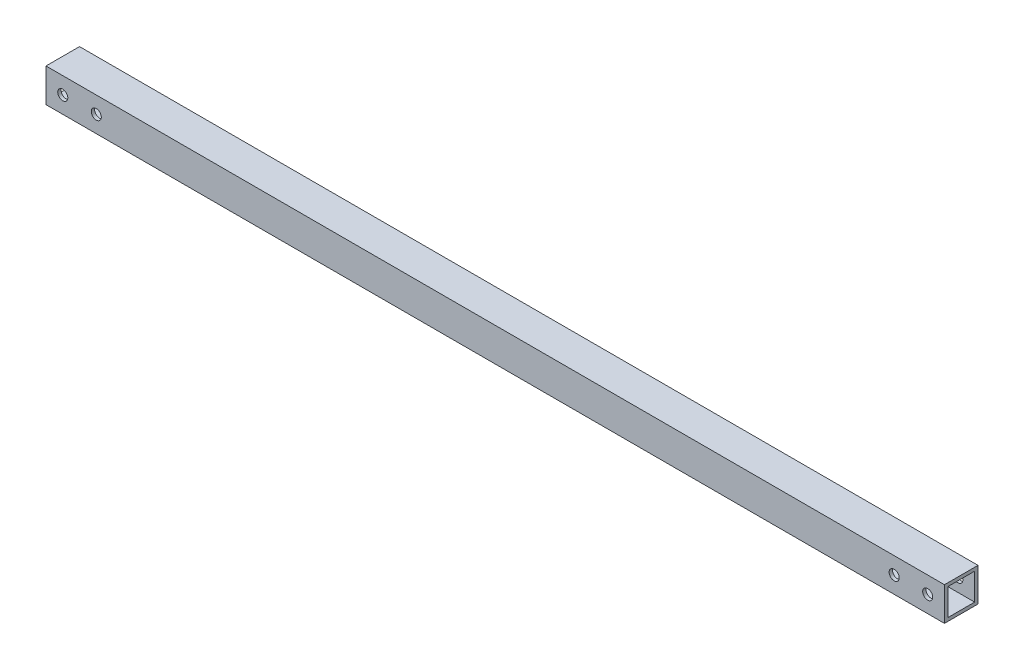
ISO-10303-21;
HEADER;
FILE_DESCRIPTION(('STEP AP214'),'2;1');
FILE_NAME('part.step','',(''),(''),'','','');
FILE_SCHEMA(('AUTOMOTIVE_DESIGN { 1 0 10303 214 1 1 1 1 }'));
ENDSEC;
DATA;
#1=APPLICATION_CONTEXT('core data for automotive mechanical design processes');
#2=APPLICATION_PROTOCOL_DEFINITION('international standard','automotive_design',2000,#1);
#3=PRODUCT_CONTEXT('',#1,'mechanical');
#4=PRODUCT('Part','Part','',(#3));
#5=PRODUCT_RELATED_PRODUCT_CATEGORY('part','',(#4));
#6=PRODUCT_DEFINITION_FORMATION('','',#4);
#7=PRODUCT_DEFINITION_CONTEXT('part definition',#1,'design');
#8=PRODUCT_DEFINITION('design','',#6,#7);
#9=PRODUCT_DEFINITION_SHAPE('','',#8);
#10=(LENGTH_UNIT() NAMED_UNIT(*) SI_UNIT(.MILLI.,.METRE.));
#11=(NAMED_UNIT(*) PLANE_ANGLE_UNIT() SI_UNIT($,.RADIAN.));
#12=(NAMED_UNIT(*) SI_UNIT($,.STERADIAN.) SOLID_ANGLE_UNIT());
#13=UNCERTAINTY_MEASURE_WITH_UNIT(LENGTH_MEASURE(1.E-05),#10,'distance_accuracy_value','');
#14=(GEOMETRIC_REPRESENTATION_CONTEXT(3) GLOBAL_UNCERTAINTY_ASSIGNED_CONTEXT((#13)) GLOBAL_UNIT_ASSIGNED_CONTEXT((#10,
#11,#12)) REPRESENTATION_CONTEXT('',''));
#15=CARTESIAN_POINT('',(0.,0.,0.));
#16=DIRECTION('',(0.,0.,1.));
#17=DIRECTION('',(1.,0.,0.));
#18=AXIS2_PLACEMENT_3D('',#15,#16,#17);
#19=CARTESIAN_POINT('',(268.,0.,0.));
#20=DIRECTION('',(1.,0.,0.));
#21=DIRECTION('',(0.,0.,-1.));
#22=AXIS2_PLACEMENT_3D('',#19,#20,#21);
#23=PLANE('',#22);
#24=DIRECTION('',(0.,-1.,0.));
#25=VECTOR('',#24,1.);
#26=CARTESIAN_POINT('',(268.,10.,10.));
#27=LINE('',#26,#25);
#28=CARTESIAN_POINT('',(268.,10.,10.));
#29=VERTEX_POINT('',#28);
#30=CARTESIAN_POINT('',(268.,-10.,10.));
#31=VERTEX_POINT('',#30);
#32=EDGE_CURVE('E140',#29,#31,#27,.T.);
#33=ORIENTED_EDGE('',*,*,#32,.T.);
#34=DIRECTION('',(0.,0.,-1.));
#35=VECTOR('',#34,1.);
#36=CARTESIAN_POINT('',(268.,-10.,10.));
#37=LINE('',#36,#35);
#38=CARTESIAN_POINT('',(268.,-10.,-10.));
#39=VERTEX_POINT('',#38);
#40=EDGE_CURVE('E143',#31,#39,#37,.T.);
#41=ORIENTED_EDGE('',*,*,#40,.T.);
#42=DIRECTION('',(0.,1.,0.));
#43=VECTOR('',#42,1.);
#44=CARTESIAN_POINT('',(268.,10.,-10.));
#45=LINE('',#44,#43);
#46=CARTESIAN_POINT('',(268.,10.,-10.));
#47=VERTEX_POINT('',#46);
#48=EDGE_CURVE('E146',#39,#47,#45,.T.);
#49=ORIENTED_EDGE('',*,*,#48,.T.);
#50=DIRECTION('',(0.,0.,1.));
#51=VECTOR('',#50,1.);
#52=CARTESIAN_POINT('',(268.,10.,10.));
#53=LINE('',#52,#51);
#54=EDGE_CURVE('E148',#47,#29,#53,.T.);
#55=ORIENTED_EDGE('',*,*,#54,.T.);
#56=EDGE_LOOP('',(#33,#41,#49,#55));
#57=FACE_BOUND('',#56,.T.);
#58=DIRECTION('',(0.,1.,0.));
#59=VECTOR('',#58,1.);
#60=CARTESIAN_POINT('',(268.,8.,-8.));
#61=LINE('',#60,#59);
#62=CARTESIAN_POINT('',(268.,-8.,-8.));
#63=VERTEX_POINT('',#62);
#64=CARTESIAN_POINT('',(268.,8.,-8.));
#65=VERTEX_POINT('',#64);
#66=EDGE_CURVE('E110',#63,#65,#61,.T.);
#67=ORIENTED_EDGE('',*,*,#66,.F.);
#68=DIRECTION('',(0.,0.,-1.));
#69=VECTOR('',#68,1.);
#70=CARTESIAN_POINT('',(268.,-8.,-8.));
#71=LINE('',#70,#69);
#72=CARTESIAN_POINT('',(268.,-8.,8.));
#73=VERTEX_POINT('',#72);
#74=EDGE_CURVE('E102',#73,#63,#71,.T.);
#75=ORIENTED_EDGE('',*,*,#74,.F.);
#76=DIRECTION('',(0.,-1.,0.));
#77=VECTOR('',#76,1.);
#78=CARTESIAN_POINT('',(268.,8.,8.));
#79=LINE('',#78,#77);
#80=CARTESIAN_POINT('',(268.,8.,8.));
#81=VERTEX_POINT('',#80);
#82=EDGE_CURVE('E124',#81,#73,#79,.T.);
#83=ORIENTED_EDGE('',*,*,#82,.F.);
#84=DIRECTION('',(0.,0.,1.));
#85=VECTOR('',#84,1.);
#86=CARTESIAN_POINT('',(268.,8.,-8.));
#87=LINE('',#86,#85);
#88=EDGE_CURVE('E122',#65,#81,#87,.T.);
#89=ORIENTED_EDGE('',*,*,#88,.F.);
#90=EDGE_LOOP('',(#67,#75,#83,#89));
#91=FACE_BOUND('',#90,.T.);
#92=ADVANCED_FACE('F35',(#57,#91),#23,.T.);
#93=CARTESIAN_POINT('',(-268.,0.,0.));
#94=DIRECTION('',(1.,0.,0.));
#95=DIRECTION('',(0.,0.,-1.));
#96=AXIS2_PLACEMENT_3D('',#93,#94,#95);
#97=PLANE('',#96);
#98=DIRECTION('',(0.,-1.,0.));
#99=VECTOR('',#98,1.);
#100=CARTESIAN_POINT('',(-268.,10.,10.));
#101=LINE('',#100,#99);
#102=CARTESIAN_POINT('',(-268.,10.,10.));
#103=VERTEX_POINT('',#102);
#104=CARTESIAN_POINT('',(-268.,-10.,10.));
#105=VERTEX_POINT('',#104);
#106=EDGE_CURVE('E118',#103,#105,#101,.T.);
#107=ORIENTED_EDGE('',*,*,#106,.F.);
#108=DIRECTION('',(0.,0.,1.));
#109=VECTOR('',#108,1.);
#110=CARTESIAN_POINT('',(-268.,10.,10.));
#111=LINE('',#110,#109);
#112=CARTESIAN_POINT('',(-268.,10.,-10.));
#113=VERTEX_POINT('',#112);
#114=EDGE_CURVE('E144',#113,#103,#111,.T.);
#115=ORIENTED_EDGE('',*,*,#114,.F.);
#116=DIRECTION('',(0.,1.,0.));
#117=VECTOR('',#116,1.);
#118=CARTESIAN_POINT('',(-268.,10.,-10.));
#119=LINE('',#118,#117);
#120=CARTESIAN_POINT('',(-268.,-10.,-10.));
#121=VERTEX_POINT('',#120);
#122=EDGE_CURVE('E155',#121,#113,#119,.T.);
#123=ORIENTED_EDGE('',*,*,#122,.F.);
#124=DIRECTION('',(0.,0.,-1.));
#125=VECTOR('',#124,1.);
#126=CARTESIAN_POINT('',(-268.,-10.,10.));
#127=LINE('',#126,#125);
#128=EDGE_CURVE('E153',#105,#121,#127,.T.);
#129=ORIENTED_EDGE('',*,*,#128,.F.);
#130=EDGE_LOOP('',(#107,#115,#123,#129));
#131=FACE_BOUND('',#130,.T.);
#132=DIRECTION('',(0.,0.,-1.));
#133=VECTOR('',#132,1.);
#134=CARTESIAN_POINT('',(-268.,-8.,-8.));
#135=LINE('',#134,#133);
#136=CARTESIAN_POINT('',(-268.,-8.,8.));
#137=VERTEX_POINT('',#136);
#138=CARTESIAN_POINT('',(-268.,-8.,-8.));
#139=VERTEX_POINT('',#138);
#140=EDGE_CURVE('E60',#137,#139,#135,.T.);
#141=ORIENTED_EDGE('',*,*,#140,.T.);
#142=DIRECTION('',(0.,1.,0.));
#143=VECTOR('',#142,1.);
#144=CARTESIAN_POINT('',(-268.,8.,-8.));
#145=LINE('',#144,#143);
#146=CARTESIAN_POINT('',(-268.,8.,-8.));
#147=VERTEX_POINT('',#146);
#148=EDGE_CURVE('E117',#139,#147,#145,.T.);
#149=ORIENTED_EDGE('',*,*,#148,.T.);
#150=DIRECTION('',(0.,0.,1.));
#151=VECTOR('',#150,1.);
#152=CARTESIAN_POINT('',(-268.,8.,-8.));
#153=LINE('',#152,#151);
#154=CARTESIAN_POINT('',(-268.,8.,8.));
#155=VERTEX_POINT('',#154);
#156=EDGE_CURVE('E132',#147,#155,#153,.T.);
#157=ORIENTED_EDGE('',*,*,#156,.T.);
#158=DIRECTION('',(0.,-1.,0.));
#159=VECTOR('',#158,1.);
#160=CARTESIAN_POINT('',(-268.,8.,8.));
#161=LINE('',#160,#159);
#162=EDGE_CURVE('E111',#155,#137,#161,.T.);
#163=ORIENTED_EDGE('',*,*,#162,.T.);
#164=EDGE_LOOP('',(#141,#149,#157,#163));
#165=FACE_BOUND('',#164,.T.);
#166=ADVANCED_FACE('F227',(#131,#165),#97,.F.);
#167=CARTESIAN_POINT('',(268.,10.,10.));
#168=DIRECTION('',(0.,0.,-1.));
#169=DIRECTION('',(-1.,0.,0.));
#170=AXIS2_PLACEMENT_3D('',#167,#168,#169);
#171=PLANE('',#170);
#172=CARTESIAN_POINT('',(-258.,0.,10.));
#173=DIRECTION('',(0.,0.,1.));
#174=DIRECTION('',(1.,0.,0.));
#175=AXIS2_PLACEMENT_3D('',#172,#173,#174);
#176=CIRCLE('',#175,2.99999999999999);
#177=CARTESIAN_POINT('',(-255.,0.,10.));
#178=VERTEX_POINT('',#177);
#179=EDGE_CURVE('E299',#178,#178,#176,.T.);
#180=ORIENTED_EDGE('',*,*,#179,.F.);
#181=EDGE_LOOP('',(#180));
#182=FACE_BOUND('',#181,.T.);
#183=CARTESIAN_POINT('',(-238.,0.,10.));
#184=DIRECTION('',(0.,0.,1.));
#185=DIRECTION('',(1.,0.,0.));
#186=AXIS2_PLACEMENT_3D('',#183,#184,#185);
#187=CIRCLE('',#186,2.99999999999999);
#188=CARTESIAN_POINT('',(-235.,0.,10.));
#189=VERTEX_POINT('',#188);
#190=EDGE_CURVE('E183',#189,#189,#187,.T.);
#191=ORIENTED_EDGE('',*,*,#190,.F.);
#192=EDGE_LOOP('',(#191));
#193=FACE_BOUND('',#192,.T.);
#194=CARTESIAN_POINT('',(238.,0.,10.));
#195=DIRECTION('',(0.,0.,1.));
#196=DIRECTION('',(1.,0.,0.));
#197=AXIS2_PLACEMENT_3D('',#194,#195,#196);
#198=CIRCLE('',#197,2.99999999999999);
#199=CARTESIAN_POINT('',(241.,0.,10.));
#200=VERTEX_POINT('',#199);
#201=EDGE_CURVE('E180',#200,#200,#198,.T.);
#202=ORIENTED_EDGE('',*,*,#201,.F.);
#203=EDGE_LOOP('',(#202));
#204=FACE_BOUND('',#203,.T.);
#205=CARTESIAN_POINT('',(258.,0.,10.));
#206=DIRECTION('',(0.,0.,1.));
#207=DIRECTION('',(1.,0.,0.));
#208=AXIS2_PLACEMENT_3D('',#205,#206,#207);
#209=CIRCLE('',#208,2.99999999999999);
#210=CARTESIAN_POINT('',(261.,0.,10.));
#211=VERTEX_POINT('',#210);
#212=EDGE_CURVE('E199',#211,#211,#209,.T.);
#213=ORIENTED_EDGE('',*,*,#212,.F.);
#214=EDGE_LOOP('',(#213));
#215=FACE_BOUND('',#214,.T.);
#216=ORIENTED_EDGE('',*,*,#106,.T.);
#217=DIRECTION('',(-1.,0.,0.));
#218=VECTOR('',#217,1.);
#219=CARTESIAN_POINT('',(268.,-10.,10.));
#220=LINE('',#219,#218);
#221=EDGE_CURVE('E11',#31,#105,#220,.T.);
#222=ORIENTED_EDGE('',*,*,#221,.F.);
#223=ORIENTED_EDGE('',*,*,#32,.F.);
#224=DIRECTION('',(-1.,0.,0.));
#225=VECTOR('',#224,1.);
#226=CARTESIAN_POINT('',(268.,10.,10.));
#227=LINE('',#226,#225);
#228=EDGE_CURVE('E150',#29,#103,#227,.T.);
#229=ORIENTED_EDGE('',*,*,#228,.T.);
#230=EDGE_LOOP('',(#216,#222,#223,#229));
#231=FACE_BOUND('',#230,.T.);
#232=ADVANCED_FACE('F37',(#182,#193,#204,#215,#231),#171,.F.);
#233=CARTESIAN_POINT('',(268.,-10.,10.));
#234=DIRECTION('',(0.,1.,0.));
#235=DIRECTION('',(0.,0.,1.));
#236=AXIS2_PLACEMENT_3D('',#233,#234,#235);
#237=PLANE('',#236);
#238=ORIENTED_EDGE('',*,*,#128,.T.);
#239=DIRECTION('',(-1.,0.,0.));
#240=VECTOR('',#239,1.);
#241=CARTESIAN_POINT('',(268.,-10.,-10.));
#242=LINE('',#241,#240);
#243=EDGE_CURVE('E44',#39,#121,#242,.T.);
#244=ORIENTED_EDGE('',*,*,#243,.F.);
#245=ORIENTED_EDGE('',*,*,#40,.F.);
#246=ORIENTED_EDGE('',*,*,#221,.T.);
#247=EDGE_LOOP('',(#238,#244,#245,#246));
#248=FACE_BOUND('',#247,.T.);
#249=ADVANCED_FACE('F240',(#248),#237,.F.);
#250=CARTESIAN_POINT('',(268.,10.,-10.));
#251=DIRECTION('',(0.,0.,1.));
#252=DIRECTION('',(1.,0.,0.));
#253=AXIS2_PLACEMENT_3D('',#250,#251,#252);
#254=PLANE('',#253);
#255=CARTESIAN_POINT('',(-258.,0.,-10.));
#256=DIRECTION('',(0.,0.,1.));
#257=DIRECTION('',(1.,0.,0.));
#258=AXIS2_PLACEMENT_3D('',#255,#256,#257);
#259=CIRCLE('',#258,2.99999999999999);
#260=CARTESIAN_POINT('',(-255.,0.,-10.));
#261=VERTEX_POINT('',#260);
#262=EDGE_CURVE('E300',#261,#261,#259,.T.);
#263=ORIENTED_EDGE('',*,*,#262,.T.);
#264=EDGE_LOOP('',(#263));
#265=FACE_BOUND('',#264,.T.);
#266=CARTESIAN_POINT('',(-238.,0.,-10.));
#267=DIRECTION('',(0.,0.,1.));
#268=DIRECTION('',(1.,0.,0.));
#269=AXIS2_PLACEMENT_3D('',#266,#267,#268);
#270=CIRCLE('',#269,2.99999999999999);
#271=CARTESIAN_POINT('',(-235.,0.,-10.));
#272=VERTEX_POINT('',#271);
#273=EDGE_CURVE('E176',#272,#272,#270,.T.);
#274=ORIENTED_EDGE('',*,*,#273,.T.);
#275=EDGE_LOOP('',(#274));
#276=FACE_BOUND('',#275,.T.);
#277=CARTESIAN_POINT('',(238.,0.,-10.));
#278=DIRECTION('',(0.,0.,1.));
#279=DIRECTION('',(1.,0.,0.));
#280=AXIS2_PLACEMENT_3D('',#277,#278,#279);
#281=CIRCLE('',#280,2.99999999999999);
#282=CARTESIAN_POINT('',(241.,0.,-10.));
#283=VERTEX_POINT('',#282);
#284=EDGE_CURVE('E172',#283,#283,#281,.T.);
#285=ORIENTED_EDGE('',*,*,#284,.T.);
#286=EDGE_LOOP('',(#285));
#287=FACE_BOUND('',#286,.T.);
#288=CARTESIAN_POINT('',(258.,0.,-10.));
#289=DIRECTION('',(0.,0.,1.));
#290=DIRECTION('',(1.,0.,0.));
#291=AXIS2_PLACEMENT_3D('',#288,#289,#290);
#292=CIRCLE('',#291,2.99999999999999);
#293=CARTESIAN_POINT('',(261.,0.,-10.));
#294=VERTEX_POINT('',#293);
#295=EDGE_CURVE('E168',#294,#294,#292,.T.);
#296=ORIENTED_EDGE('',*,*,#295,.T.);
#297=EDGE_LOOP('',(#296));
#298=FACE_BOUND('',#297,.T.);
#299=ORIENTED_EDGE('',*,*,#122,.T.);
#300=DIRECTION('',(-1.,0.,0.));
#301=VECTOR('',#300,1.);
#302=CARTESIAN_POINT('',(268.,10.,-10.));
#303=LINE('',#302,#301);
#304=EDGE_CURVE('E160',#47,#113,#303,.T.);
#305=ORIENTED_EDGE('',*,*,#304,.F.);
#306=ORIENTED_EDGE('',*,*,#48,.F.);
#307=ORIENTED_EDGE('',*,*,#243,.T.);
#308=EDGE_LOOP('',(#299,#305,#306,#307));
#309=FACE_BOUND('',#308,.T.);
#310=ADVANCED_FACE('F238',(#265,#276,#287,#298,#309),#254,.F.);
#311=CARTESIAN_POINT('',(268.,10.,10.));
#312=DIRECTION('',(0.,-1.,0.));
#313=DIRECTION('',(0.,0.,-1.));
#314=AXIS2_PLACEMENT_3D('',#311,#312,#313);
#315=PLANE('',#314);
#316=ORIENTED_EDGE('',*,*,#114,.T.);
#317=ORIENTED_EDGE('',*,*,#228,.F.);
#318=ORIENTED_EDGE('',*,*,#54,.F.);
#319=ORIENTED_EDGE('',*,*,#304,.T.);
#320=EDGE_LOOP('',(#316,#317,#318,#319));
#321=FACE_BOUND('',#320,.T.);
#322=ADVANCED_FACE('F222',(#321),#315,.F.);
#323=CARTESIAN_POINT('',(268.,-8.,-8.));
#324=DIRECTION('',(0.,1.,0.));
#325=DIRECTION('',(0.,0.,1.));
#326=AXIS2_PLACEMENT_3D('',#323,#324,#325);
#327=PLANE('',#326);
#328=ORIENTED_EDGE('',*,*,#140,.F.);
#329=DIRECTION('',(-1.,0.,0.));
#330=VECTOR('',#329,1.);
#331=CARTESIAN_POINT('',(268.,-8.,8.));
#332=LINE('',#331,#330);
#333=EDGE_CURVE('E106',#73,#137,#332,.T.);
#334=ORIENTED_EDGE('',*,*,#333,.F.);
#335=ORIENTED_EDGE('',*,*,#74,.T.);
#336=DIRECTION('',(-1.,0.,0.));
#337=VECTOR('',#336,1.);
#338=CARTESIAN_POINT('',(268.,-8.,-8.));
#339=LINE('',#338,#337);
#340=EDGE_CURVE('E105',#63,#139,#339,.T.);
#341=ORIENTED_EDGE('',*,*,#340,.T.);
#342=EDGE_LOOP('',(#328,#334,#335,#341));
#343=FACE_BOUND('',#342,.T.);
#344=ADVANCED_FACE('F104',(#343),#327,.T.);
#345=CARTESIAN_POINT('',(268.,8.,-8.));
#346=DIRECTION('',(0.,0.,1.));
#347=DIRECTION('',(1.,0.,0.));
#348=AXIS2_PLACEMENT_3D('',#345,#346,#347);
#349=PLANE('',#348);
#350=CARTESIAN_POINT('',(-258.,0.,-8.));
#351=DIRECTION('',(0.,0.,1.));
#352=DIRECTION('',(1.,0.,0.));
#353=AXIS2_PLACEMENT_3D('',#350,#351,#352);
#354=CIRCLE('',#353,2.99999999999999);
#355=CARTESIAN_POINT('',(-255.,0.,-8.));
#356=VERTEX_POINT('',#355);
#357=EDGE_CURVE('E188',#356,#356,#354,.T.);
#358=ORIENTED_EDGE('',*,*,#357,.F.);
#359=EDGE_LOOP('',(#358));
#360=FACE_BOUND('',#359,.T.);
#361=CARTESIAN_POINT('',(-238.,0.,-8.));
#362=DIRECTION('',(0.,0.,1.));
#363=DIRECTION('',(1.,0.,0.));
#364=AXIS2_PLACEMENT_3D('',#361,#362,#363);
#365=CIRCLE('',#364,2.99999999999999);
#366=CARTESIAN_POINT('',(-235.,0.,-8.));
#367=VERTEX_POINT('',#366);
#368=EDGE_CURVE('E175',#367,#367,#365,.T.);
#369=ORIENTED_EDGE('',*,*,#368,.F.);
#370=EDGE_LOOP('',(#369));
#371=FACE_BOUND('',#370,.T.);
#372=CARTESIAN_POINT('',(238.,0.,-8.));
#373=DIRECTION('',(0.,0.,1.));
#374=DIRECTION('',(1.,0.,0.));
#375=AXIS2_PLACEMENT_3D('',#372,#373,#374);
#376=CIRCLE('',#375,2.99999999999999);
#377=CARTESIAN_POINT('',(241.,0.,-8.));
#378=VERTEX_POINT('',#377);
#379=EDGE_CURVE('E171',#378,#378,#376,.T.);
#380=ORIENTED_EDGE('',*,*,#379,.F.);
#381=EDGE_LOOP('',(#380));
#382=FACE_BOUND('',#381,.T.);
#383=CARTESIAN_POINT('',(258.,0.,-8.));
#384=DIRECTION('',(0.,0.,1.));
#385=DIRECTION('',(1.,0.,0.));
#386=AXIS2_PLACEMENT_3D('',#383,#384,#385);
#387=CIRCLE('',#386,2.99999999999999);
#388=CARTESIAN_POINT('',(261.,0.,-8.));
#389=VERTEX_POINT('',#388);
#390=EDGE_CURVE('E130',#389,#389,#387,.T.);
#391=ORIENTED_EDGE('',*,*,#390,.F.);
#392=EDGE_LOOP('',(#391));
#393=FACE_BOUND('',#392,.T.);
#394=ORIENTED_EDGE('',*,*,#148,.F.);
#395=ORIENTED_EDGE('',*,*,#340,.F.);
#396=ORIENTED_EDGE('',*,*,#66,.T.);
#397=DIRECTION('',(-1.,0.,0.));
#398=VECTOR('',#397,1.);
#399=CARTESIAN_POINT('',(268.,8.,-8.));
#400=LINE('',#399,#398);
#401=EDGE_CURVE('E119',#65,#147,#400,.T.);
#402=ORIENTED_EDGE('',*,*,#401,.T.);
#403=EDGE_LOOP('',(#394,#395,#396,#402));
#404=FACE_BOUND('',#403,.T.);
#405=ADVANCED_FACE('F114',(#360,#371,#382,#393,#404),#349,.T.);
#406=CARTESIAN_POINT('',(268.,8.,-8.));
#407=DIRECTION('',(0.,-1.,0.));
#408=DIRECTION('',(0.,0.,-1.));
#409=AXIS2_PLACEMENT_3D('',#406,#407,#408);
#410=PLANE('',#409);
#411=ORIENTED_EDGE('',*,*,#156,.F.);
#412=ORIENTED_EDGE('',*,*,#401,.F.);
#413=ORIENTED_EDGE('',*,*,#88,.T.);
#414=DIRECTION('',(-1.,0.,0.));
#415=VECTOR('',#414,1.);
#416=CARTESIAN_POINT('',(268.,8.,8.));
#417=LINE('',#416,#415);
#418=EDGE_CURVE('E52',#81,#155,#417,.T.);
#419=ORIENTED_EDGE('',*,*,#418,.T.);
#420=EDGE_LOOP('',(#411,#412,#413,#419));
#421=FACE_BOUND('',#420,.T.);
#422=ADVANCED_FACE('F210',(#421),#410,.T.);
#423=CARTESIAN_POINT('',(268.,8.,8.));
#424=DIRECTION('',(0.,0.,-1.));
#425=DIRECTION('',(-1.,0.,0.));
#426=AXIS2_PLACEMENT_3D('',#423,#424,#425);
#427=PLANE('',#426);
#428=CARTESIAN_POINT('',(-258.,0.,8.));
#429=DIRECTION('',(0.,0.,-1.));
#430=DIRECTION('',(-1.,0.,0.));
#431=AXIS2_PLACEMENT_3D('',#428,#429,#430);
#432=CIRCLE('',#431,2.99999999999999);
#433=CARTESIAN_POINT('',(-261.,0.,8.));
#434=VERTEX_POINT('',#433);
#435=EDGE_CURVE('E39',#434,#434,#432,.T.);
#436=ORIENTED_EDGE('',*,*,#435,.F.);
#437=EDGE_LOOP('',(#436));
#438=FACE_BOUND('',#437,.T.);
#439=CARTESIAN_POINT('',(-238.,0.,8.));
#440=DIRECTION('',(0.,0.,-1.));
#441=DIRECTION('',(-1.,0.,0.));
#442=AXIS2_PLACEMENT_3D('',#439,#440,#441);
#443=CIRCLE('',#442,2.99999999999999);
#444=CARTESIAN_POINT('',(-241.,0.,8.));
#445=VERTEX_POINT('',#444);
#446=EDGE_CURVE('E173',#445,#445,#443,.T.);
#447=ORIENTED_EDGE('',*,*,#446,.F.);
#448=EDGE_LOOP('',(#447));
#449=FACE_BOUND('',#448,.T.);
#450=CARTESIAN_POINT('',(238.,0.,8.));
#451=DIRECTION('',(0.,0.,-1.));
#452=DIRECTION('',(-1.,0.,0.));
#453=AXIS2_PLACEMENT_3D('',#450,#451,#452);
#454=CIRCLE('',#453,2.99999999999999);
#455=CARTESIAN_POINT('',(235.,0.,8.));
#456=VERTEX_POINT('',#455);
#457=EDGE_CURVE('E169',#456,#456,#454,.T.);
#458=ORIENTED_EDGE('',*,*,#457,.F.);
#459=EDGE_LOOP('',(#458));
#460=FACE_BOUND('',#459,.T.);
#461=CARTESIAN_POINT('',(258.,0.,8.));
#462=DIRECTION('',(0.,0.,-1.));
#463=DIRECTION('',(-1.,0.,0.));
#464=AXIS2_PLACEMENT_3D('',#461,#462,#463);
#465=CIRCLE('',#464,2.99999999999999);
#466=CARTESIAN_POINT('',(255.,0.,8.));
#467=VERTEX_POINT('',#466);
#468=EDGE_CURVE('E165',#467,#467,#465,.T.);
#469=ORIENTED_EDGE('',*,*,#468,.F.);
#470=EDGE_LOOP('',(#469));
#471=FACE_BOUND('',#470,.T.);
#472=ORIENTED_EDGE('',*,*,#162,.F.);
#473=ORIENTED_EDGE('',*,*,#418,.F.);
#474=ORIENTED_EDGE('',*,*,#82,.T.);
#475=ORIENTED_EDGE('',*,*,#333,.T.);
#476=EDGE_LOOP('',(#472,#473,#474,#475));
#477=FACE_BOUND('',#476,.T.);
#478=ADVANCED_FACE('F218',(#438,#449,#460,#471,#477),#427,.T.);
#479=CARTESIAN_POINT('',(258.,0.,-10.));
#480=DIRECTION('',(0.,0.,1.));
#481=DIRECTION('',(1.,0.,0.));
#482=AXIS2_PLACEMENT_3D('',#479,#480,#481);
#483=CYLINDRICAL_SURFACE('',#482,2.99999999999999);
#484=ORIENTED_EDGE('',*,*,#468,.T.);
#485=EDGE_LOOP('',(#484));
#486=FACE_BOUND('',#485,.T.);
#487=ORIENTED_EDGE('',*,*,#212,.T.);
#488=EDGE_LOOP('',(#487));
#489=FACE_BOUND('',#488,.T.);
#490=ADVANCED_FACE('F264',(#486,#489),#483,.F.);
#491=ORIENTED_EDGE('',*,*,#390,.T.);
#492=EDGE_LOOP('',(#491));
#493=FACE_BOUND('',#492,.T.);
#494=ORIENTED_EDGE('',*,*,#295,.F.);
#495=EDGE_LOOP('',(#494));
#496=FACE_BOUND('',#495,.T.);
#497=ADVANCED_FACE('F206',(#493,#496),#483,.F.);
#498=CARTESIAN_POINT('',(238.,0.,-10.));
#499=DIRECTION('',(0.,0.,1.));
#500=DIRECTION('',(1.,0.,0.));
#501=AXIS2_PLACEMENT_3D('',#498,#499,#500);
#502=CYLINDRICAL_SURFACE('',#501,2.99999999999999);
#503=ORIENTED_EDGE('',*,*,#457,.T.);
#504=EDGE_LOOP('',(#503));
#505=FACE_BOUND('',#504,.T.);
#506=ORIENTED_EDGE('',*,*,#201,.T.);
#507=EDGE_LOOP('',(#506));
#508=FACE_BOUND('',#507,.T.);
#509=ADVANCED_FACE('F276',(#505,#508),#502,.F.);
#510=ORIENTED_EDGE('',*,*,#379,.T.);
#511=EDGE_LOOP('',(#510));
#512=FACE_BOUND('',#511,.T.);
#513=ORIENTED_EDGE('',*,*,#284,.F.);
#514=EDGE_LOOP('',(#513));
#515=FACE_BOUND('',#514,.T.);
#516=ADVANCED_FACE('F279',(#512,#515),#502,.F.);
#517=CARTESIAN_POINT('',(-238.,0.,-10.));
#518=DIRECTION('',(0.,0.,1.));
#519=DIRECTION('',(1.,0.,0.));
#520=AXIS2_PLACEMENT_3D('',#517,#518,#519);
#521=CYLINDRICAL_SURFACE('',#520,2.99999999999999);
#522=ORIENTED_EDGE('',*,*,#446,.T.);
#523=EDGE_LOOP('',(#522));
#524=FACE_BOUND('',#523,.T.);
#525=ORIENTED_EDGE('',*,*,#190,.T.);
#526=EDGE_LOOP('',(#525));
#527=FACE_BOUND('',#526,.T.);
#528=ADVANCED_FACE('F281',(#524,#527),#521,.F.);
#529=ORIENTED_EDGE('',*,*,#368,.T.);
#530=EDGE_LOOP('',(#529));
#531=FACE_BOUND('',#530,.T.);
#532=ORIENTED_EDGE('',*,*,#273,.F.);
#533=EDGE_LOOP('',(#532));
#534=FACE_BOUND('',#533,.T.);
#535=ADVANCED_FACE('F284',(#531,#534),#521,.F.);
#536=CARTESIAN_POINT('',(-258.,0.,-10.));
#537=DIRECTION('',(0.,0.,1.));
#538=DIRECTION('',(1.,0.,0.));
#539=AXIS2_PLACEMENT_3D('',#536,#537,#538);
#540=CYLINDRICAL_SURFACE('',#539,2.99999999999999);
#541=ORIENTED_EDGE('',*,*,#435,.T.);
#542=EDGE_LOOP('',(#541));
#543=FACE_BOUND('',#542,.T.);
#544=ORIENTED_EDGE('',*,*,#179,.T.);
#545=EDGE_LOOP('',(#544));
#546=FACE_BOUND('',#545,.T.);
#547=ADVANCED_FACE('F285',(#543,#546),#540,.F.);
#548=ORIENTED_EDGE('',*,*,#357,.T.);
#549=EDGE_LOOP('',(#548));
#550=FACE_BOUND('',#549,.T.);
#551=ORIENTED_EDGE('',*,*,#262,.F.);
#552=EDGE_LOOP('',(#551));
#553=FACE_BOUND('',#552,.T.);
#554=ADVANCED_FACE('F287',(#550,#553),#540,.F.);
#555=CLOSED_SHELL('',(#92,#166,#232,#249,#310,#322,#344,#405,#422,#478,#490,#497,#509,#516,#528,
#535,#547,#554));
#556=MANIFOLD_SOLID_BREP('B2',#555);
#557=ADVANCED_BREP_SHAPE_REPRESENTATION('',(#18,#556),#14);
#558=SHAPE_DEFINITION_REPRESENTATION(#9,#557);
ENDSEC;
END-ISO-10303-21;
